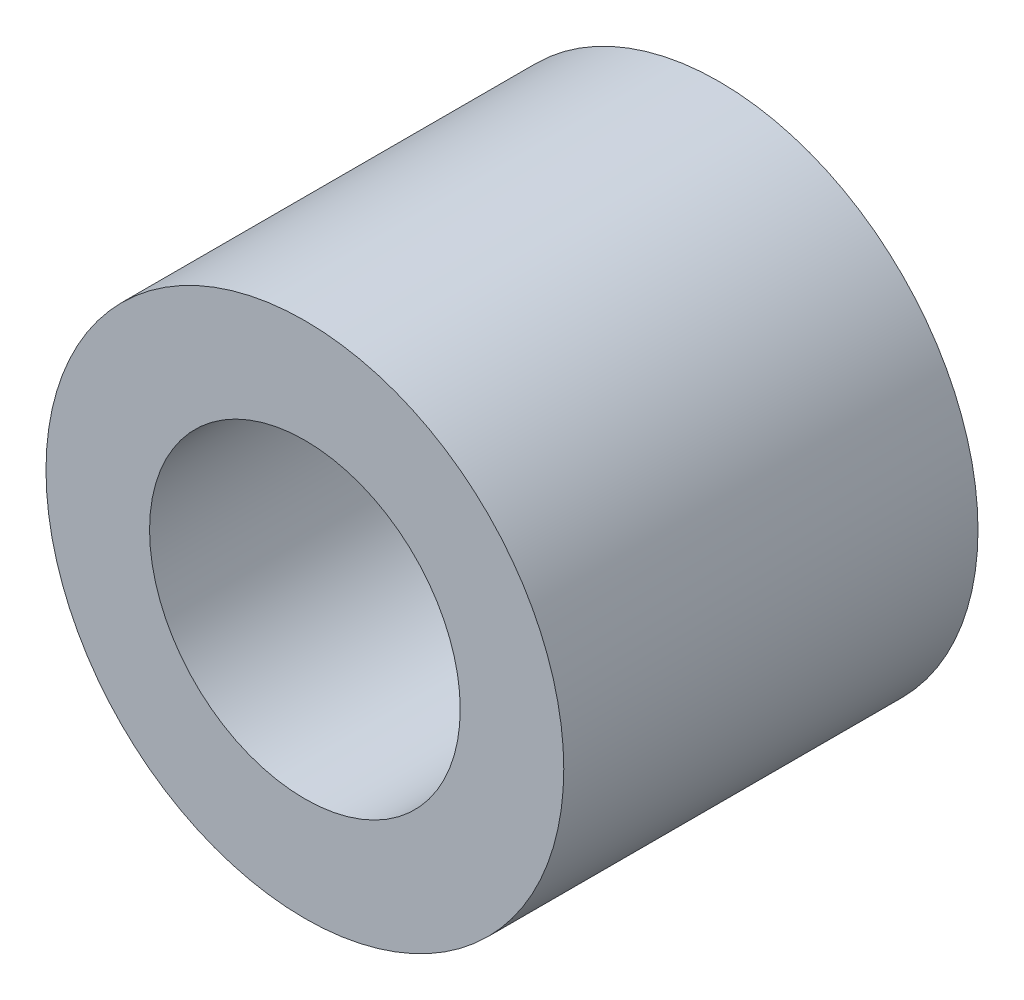
ISO-10303-21;
HEADER;
FILE_DESCRIPTION(('STEP AP214'),'2;1');
FILE_NAME('part.step','',(''),(''),'','','');
FILE_SCHEMA(('AUTOMOTIVE_DESIGN { 1 0 10303 214 1 1 1 1 }'));
ENDSEC;
DATA;
#1=APPLICATION_CONTEXT('core data for automotive mechanical design processes');
#2=APPLICATION_PROTOCOL_DEFINITION('international standard','automotive_design',2000,#1);
#3=PRODUCT_CONTEXT('',#1,'mechanical');
#4=PRODUCT('Part','Part','',(#3));
#5=PRODUCT_RELATED_PRODUCT_CATEGORY('part','',(#4));
#6=PRODUCT_DEFINITION_FORMATION('','',#4);
#7=PRODUCT_DEFINITION_CONTEXT('part definition',#1,'design');
#8=PRODUCT_DEFINITION('design','',#6,#7);
#9=PRODUCT_DEFINITION_SHAPE('','',#8);
#10=(LENGTH_UNIT() NAMED_UNIT(*) SI_UNIT(.MILLI.,.METRE.));
#11=(NAMED_UNIT(*) PLANE_ANGLE_UNIT() SI_UNIT($,.RADIAN.));
#12=(NAMED_UNIT(*) SI_UNIT($,.STERADIAN.) SOLID_ANGLE_UNIT());
#13=UNCERTAINTY_MEASURE_WITH_UNIT(LENGTH_MEASURE(1.E-05),#10,'distance_accuracy_value','');
#14=(GEOMETRIC_REPRESENTATION_CONTEXT(3) GLOBAL_UNCERTAINTY_ASSIGNED_CONTEXT((#13)) GLOBAL_UNIT_ASSIGNED_CONTEXT((#10,
#11,#12)) REPRESENTATION_CONTEXT('',''));
#15=CARTESIAN_POINT('',(0.,0.,0.));
#16=DIRECTION('',(0.,0.,1.));
#17=DIRECTION('',(1.,0.,0.));
#18=AXIS2_PLACEMENT_3D('',#15,#16,#17);
#19=CARTESIAN_POINT('',(0.,0.,2.4));
#20=DIRECTION('',(0.,0.,1.));
#21=DIRECTION('',(1.,0.,0.));
#22=AXIS2_PLACEMENT_3D('',#19,#20,#21);
#23=PLANE('',#22);
#24=CARTESIAN_POINT('',(0.,0.,2.4));
#25=DIRECTION('',(0.,0.,1.));
#26=DIRECTION('',(1.,0.,0.));
#27=AXIS2_PLACEMENT_3D('',#24,#25,#26);
#28=CIRCLE('',#27,1.5);
#29=CARTESIAN_POINT('',(1.5,0.,2.4));
#30=VERTEX_POINT('',#29);
#31=EDGE_CURVE('E10',#30,#30,#28,.T.);
#32=ORIENTED_EDGE('',*,*,#31,.T.);
#33=EDGE_LOOP('',(#32));
#34=FACE_BOUND('',#33,.T.);
#35=CARTESIAN_POINT('',(0.,0.,2.4));
#36=DIRECTION('',(0.,0.,1.));
#37=DIRECTION('',(1.,0.,0.));
#38=AXIS2_PLACEMENT_3D('',#35,#36,#37);
#39=CIRCLE('',#38,0.9);
#40=CARTESIAN_POINT('',(0.9,0.,2.4));
#41=VERTEX_POINT('',#40);
#42=EDGE_CURVE('E56',#41,#41,#39,.T.);
#43=ORIENTED_EDGE('',*,*,#42,.F.);
#44=EDGE_LOOP('',(#43));
#45=FACE_BOUND('',#44,.T.);
#46=ADVANCED_FACE('F45',(#34,#45),#23,.T.);
#47=CARTESIAN_POINT('',(0.,0.,0.));
#48=DIRECTION('',(0.,0.,1.));
#49=DIRECTION('',(1.,0.,0.));
#50=AXIS2_PLACEMENT_3D('',#47,#48,#49);
#51=PLANE('',#50);
#52=CARTESIAN_POINT('',(0.,0.,0.));
#53=DIRECTION('',(0.,0.,1.));
#54=DIRECTION('',(1.,0.,0.));
#55=AXIS2_PLACEMENT_3D('',#52,#53,#54);
#56=CIRCLE('',#55,1.5);
#57=CARTESIAN_POINT('',(1.5,0.,0.));
#58=VERTEX_POINT('',#57);
#59=EDGE_CURVE('E49',#58,#58,#56,.T.);
#60=ORIENTED_EDGE('',*,*,#59,.F.);
#61=EDGE_LOOP('',(#60));
#62=FACE_BOUND('',#61,.T.);
#63=CARTESIAN_POINT('',(0.,0.,0.));
#64=DIRECTION('',(0.,0.,1.));
#65=DIRECTION('',(1.,0.,0.));
#66=AXIS2_PLACEMENT_3D('',#63,#64,#65);
#67=CIRCLE('',#66,0.9);
#68=CARTESIAN_POINT('',(0.9,0.,0.));
#69=VERTEX_POINT('',#68);
#70=EDGE_CURVE('E58',#69,#69,#67,.T.);
#71=ORIENTED_EDGE('',*,*,#70,.T.);
#72=EDGE_LOOP('',(#71));
#73=FACE_BOUND('',#72,.T.);
#74=ADVANCED_FACE('F68',(#62,#73),#51,.F.);
#75=CARTESIAN_POINT('',(0.,0.,2.4));
#76=DIRECTION('',(0.,0.,-1.));
#77=DIRECTION('',(-1.,0.,0.));
#78=AXIS2_PLACEMENT_3D('',#75,#76,#77);
#79=CYLINDRICAL_SURFACE('',#78,1.5);
#80=ORIENTED_EDGE('',*,*,#31,.F.);
#81=EDGE_LOOP('',(#80));
#82=FACE_BOUND('',#81,.T.);
#83=ORIENTED_EDGE('',*,*,#59,.T.);
#84=EDGE_LOOP('',(#83));
#85=FACE_BOUND('',#84,.T.);
#86=ADVANCED_FACE('F47',(#82,#85),#79,.T.);
#87=CARTESIAN_POINT('',(0.,0.,2.4));
#88=DIRECTION('',(0.,0.,-1.));
#89=DIRECTION('',(-1.,0.,0.));
#90=AXIS2_PLACEMENT_3D('',#87,#88,#89);
#91=CYLINDRICAL_SURFACE('',#90,0.9);
#92=ORIENTED_EDGE('',*,*,#42,.T.);
#93=EDGE_LOOP('',(#92));
#94=FACE_BOUND('',#93,.T.);
#95=ORIENTED_EDGE('',*,*,#70,.F.);
#96=EDGE_LOOP('',(#95));
#97=FACE_BOUND('',#96,.T.);
#98=ADVANCED_FACE('F64',(#94,#97),#91,.F.);
#99=CLOSED_SHELL('',(#46,#74,#86,#98));
#100=MANIFOLD_SOLID_BREP('B2',#99);
#101=ADVANCED_BREP_SHAPE_REPRESENTATION('',(#18,#100),#14);
#102=SHAPE_DEFINITION_REPRESENTATION(#9,#101);
ENDSEC;
END-ISO-10303-21;
